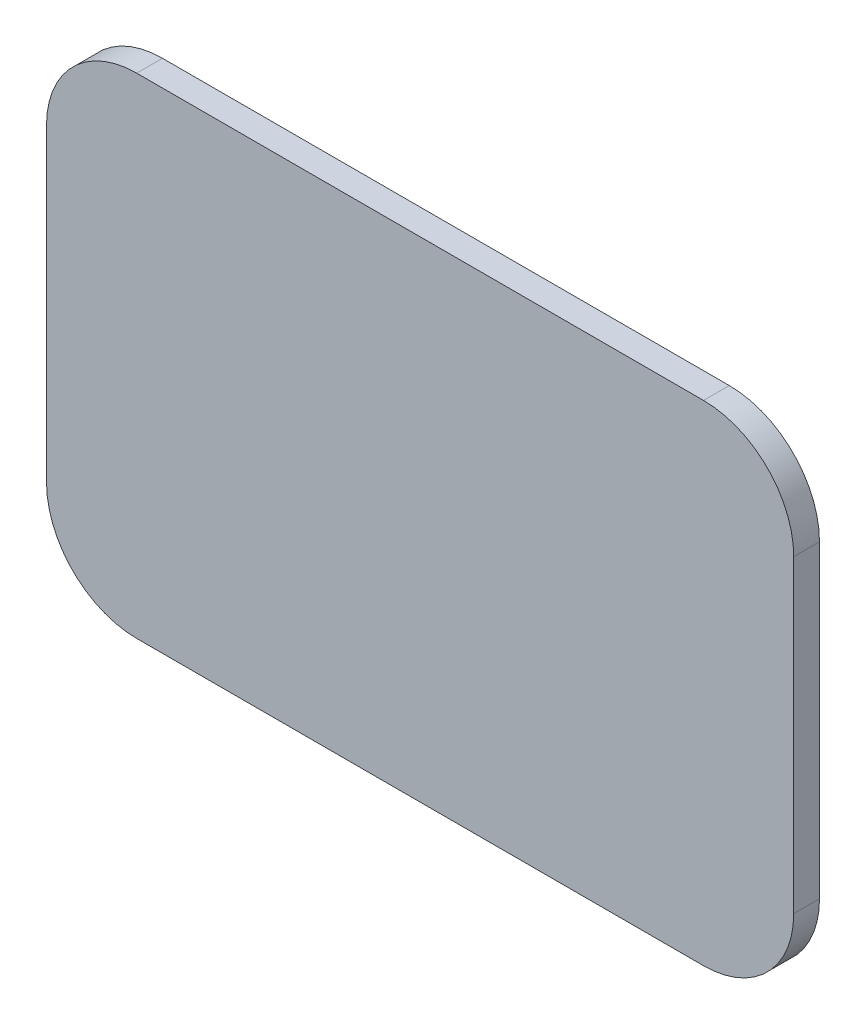
ISO-10303-21;
HEADER;
FILE_DESCRIPTION(('STEP AP214'),'2;1');
FILE_NAME('part.step','',(''),(''),'','','');
FILE_SCHEMA(('AUTOMOTIVE_DESIGN { 1 0 10303 214 1 1 1 1 }'));
ENDSEC;
DATA;
#1=APPLICATION_CONTEXT('core data for automotive mechanical design processes');
#2=APPLICATION_PROTOCOL_DEFINITION('international standard','automotive_design',2000,#1);
#3=PRODUCT_CONTEXT('',#1,'mechanical');
#4=PRODUCT('Part','Part','',(#3));
#5=PRODUCT_RELATED_PRODUCT_CATEGORY('part','',(#4));
#6=PRODUCT_DEFINITION_FORMATION('','',#4);
#7=PRODUCT_DEFINITION_CONTEXT('part definition',#1,'design');
#8=PRODUCT_DEFINITION('design','',#6,#7);
#9=PRODUCT_DEFINITION_SHAPE('','',#8);
#10=(LENGTH_UNIT() NAMED_UNIT(*) SI_UNIT(.MILLI.,.METRE.));
#11=(NAMED_UNIT(*) PLANE_ANGLE_UNIT() SI_UNIT($,.RADIAN.));
#12=(NAMED_UNIT(*) SI_UNIT($,.STERADIAN.) SOLID_ANGLE_UNIT());
#13=UNCERTAINTY_MEASURE_WITH_UNIT(LENGTH_MEASURE(1.E-05),#10,'distance_accuracy_value','');
#14=(GEOMETRIC_REPRESENTATION_CONTEXT(3) GLOBAL_UNCERTAINTY_ASSIGNED_CONTEXT((#13)) GLOBAL_UNIT_ASSIGNED_CONTEXT((#10,
#11,#12)) REPRESENTATION_CONTEXT('',''));
#15=CARTESIAN_POINT('',(0.,0.,0.));
#16=DIRECTION('',(0.,0.,1.));
#17=DIRECTION('',(1.,0.,0.));
#18=AXIS2_PLACEMENT_3D('',#15,#16,#17);
#19=CARTESIAN_POINT('',(-14.5,0.,1.));
#20=DIRECTION('',(-1.,0.,0.));
#21=DIRECTION('',(0.,0.,1.));
#22=AXIS2_PLACEMENT_3D('',#19,#20,#21);
#23=PLANE('',#22);
#24=DIRECTION('',(0.,1.00000000000001,0.));
#25=VECTOR('',#24,1.);
#26=CARTESIAN_POINT('',(-14.5,0.,0.));
#27=LINE('',#26,#25);
#28=CARTESIAN_POINT('',(-14.5,-6.00000000000032,0.));
#29=VERTEX_POINT('',#28);
#30=CARTESIAN_POINT('',(-14.5,5.99999999999998,0.));
#31=VERTEX_POINT('',#30);
#32=EDGE_CURVE('E127',#29,#31,#27,.T.);
#33=ORIENTED_EDGE('',*,*,#32,.F.);
#34=DIRECTION('',(0.,0.,-1.));
#35=VECTOR('',#34,1.);
#36=CARTESIAN_POINT('',(-14.5,-6.00000000000032,1.00000000000005));
#37=LINE('',#36,#35);
#38=CARTESIAN_POINT('',(-14.5,-6.00000000000032,1.00000000000005));
#39=VERTEX_POINT('',#38);
#40=EDGE_CURVE('E11',#39,#29,#37,.T.);
#41=ORIENTED_EDGE('',*,*,#40,.F.);
#42=DIRECTION('',(0.,1.00000000000001,0.));
#43=VECTOR('',#42,1.);
#44=CARTESIAN_POINT('',(-14.5,0.,1.));
#45=LINE('',#44,#43);
#46=CARTESIAN_POINT('',(-14.5,5.99999999999998,1.));
#47=VERTEX_POINT('',#46);
#48=EDGE_CURVE('E143',#39,#47,#45,.T.);
#49=ORIENTED_EDGE('',*,*,#48,.T.);
#50=DIRECTION('',(0.,0.,-1.));
#51=VECTOR('',#50,1.);
#52=CARTESIAN_POINT('',(-14.5,5.99999999999998,1.));
#53=LINE('',#52,#51);
#54=EDGE_CURVE('E83',#47,#31,#53,.T.);
#55=ORIENTED_EDGE('',*,*,#54,.T.);
#56=EDGE_LOOP('',(#33,#41,#49,#55));
#57=FACE_BOUND('',#56,.T.);
#58=ADVANCED_FACE('F33',(#57),#23,.T.);
#59=CARTESIAN_POINT('',(-11.,-6.00000000000035,1.00000000000005));
#60=DIRECTION('',(0.,0.,-1.));
#61=DIRECTION('',(-1.,0.,0.));
#62=AXIS2_PLACEMENT_3D('',#59,#60,#61);
#63=CYLINDRICAL_SURFACE('',#62,3.5);
#64=CARTESIAN_POINT('',(-11.,-6.00000000000035,0.));
#65=DIRECTION('',(0.,0.,1.00000000000001));
#66=DIRECTION('',(1.,0.,0.));
#67=AXIS2_PLACEMENT_3D('',#64,#65,#66);
#68=CIRCLE('',#67,3.5);
#69=CARTESIAN_POINT('',(-11.,-9.50000000000001,0.));
#70=VERTEX_POINT('',#69);
#71=EDGE_CURVE('E130',#29,#70,#68,.T.);
#72=ORIENTED_EDGE('',*,*,#71,.T.);
#73=DIRECTION('',(0.,0.,-1.));
#74=VECTOR('',#73,1.);
#75=CARTESIAN_POINT('',(-11.,-9.50000000000001,1.00000000000005));
#76=LINE('',#75,#74);
#77=CARTESIAN_POINT('',(-11.,-9.50000000000001,1.00000000000005));
#78=VERTEX_POINT('',#77);
#79=EDGE_CURVE('E41',#78,#70,#76,.T.);
#80=ORIENTED_EDGE('',*,*,#79,.F.);
#81=CARTESIAN_POINT('',(-11.,-6.00000000000035,1.00000000000005));
#82=DIRECTION('',(0.,0.,1.00000000000001));
#83=DIRECTION('',(1.,0.,0.));
#84=AXIS2_PLACEMENT_3D('',#81,#82,#83);
#85=CIRCLE('',#84,3.5);
#86=EDGE_CURVE('E176',#39,#78,#85,.T.);
#87=ORIENTED_EDGE('',*,*,#86,.F.);
#88=ORIENTED_EDGE('',*,*,#40,.T.);
#89=EDGE_LOOP('',(#72,#80,#87,#88));
#90=FACE_BOUND('',#89,.T.);
#91=ADVANCED_FACE('F178',(#90),#63,.T.);
#92=CARTESIAN_POINT('',(0.,-9.50000000000001,1.00000000000005));
#93=DIRECTION('',(0.,1.,0.));
#94=DIRECTION('',(0.,0.,1.));
#95=AXIS2_PLACEMENT_3D('',#92,#93,#94);
#96=PLANE('',#95);
#97=DIRECTION('',(1.,0.,0.));
#98=VECTOR('',#97,1.);
#99=CARTESIAN_POINT('',(0.,-9.50000000000001,0.));
#100=LINE('',#99,#98);
#101=CARTESIAN_POINT('',(11.,-9.50000000000001,0.));
#102=VERTEX_POINT('',#101);
#103=EDGE_CURVE('E132',#70,#102,#100,.T.);
#104=ORIENTED_EDGE('',*,*,#103,.T.);
#105=DIRECTION('',(0.,0.,-1.));
#106=VECTOR('',#105,1.);
#107=CARTESIAN_POINT('',(11.,-9.50000000000001,1.00000000000005));
#108=LINE('',#107,#106);
#109=CARTESIAN_POINT('',(11.,-9.50000000000001,1.00000000000005));
#110=VERTEX_POINT('',#109);
#111=EDGE_CURVE('E150',#110,#102,#108,.T.);
#112=ORIENTED_EDGE('',*,*,#111,.F.);
#113=DIRECTION('',(1.,0.,0.));
#114=VECTOR('',#113,1.);
#115=CARTESIAN_POINT('',(0.,-9.50000000000001,1.00000000000005));
#116=LINE('',#115,#114);
#117=EDGE_CURVE('E159',#78,#110,#116,.T.);
#118=ORIENTED_EDGE('',*,*,#117,.F.);
#119=ORIENTED_EDGE('',*,*,#79,.T.);
#120=EDGE_LOOP('',(#104,#112,#118,#119));
#121=FACE_BOUND('',#120,.T.);
#122=ADVANCED_FACE('F157',(#121),#96,.F.);
#123=CARTESIAN_POINT('',(11.,-6.00000000000035,1.00000000000005));
#124=DIRECTION('',(0.,0.,-1.));
#125=DIRECTION('',(-1.,0.,0.));
#126=AXIS2_PLACEMENT_3D('',#123,#124,#125);
#127=CYLINDRICAL_SURFACE('',#126,3.5);
#128=CARTESIAN_POINT('',(11.,-6.00000000000035,0.));
#129=DIRECTION('',(0.,0.,1.00000000000001));
#130=DIRECTION('',(1.,0.,0.));
#131=AXIS2_PLACEMENT_3D('',#128,#129,#130);
#132=CIRCLE('',#131,3.5);
#133=CARTESIAN_POINT('',(14.5,-6.00000000000034,0.));
#134=VERTEX_POINT('',#133);
#135=EDGE_CURVE('E134',#102,#134,#132,.T.);
#136=ORIENTED_EDGE('',*,*,#135,.T.);
#137=DIRECTION('',(0.,0.,-1.));
#138=VECTOR('',#137,1.);
#139=CARTESIAN_POINT('',(14.5,-6.00000000000034,1.00000000000005));
#140=LINE('',#139,#138);
#141=CARTESIAN_POINT('',(14.5,-6.00000000000034,1.00000000000005));
#142=VERTEX_POINT('',#141);
#143=EDGE_CURVE('E147',#142,#134,#140,.T.);
#144=ORIENTED_EDGE('',*,*,#143,.F.);
#145=CARTESIAN_POINT('',(11.,-6.00000000000035,1.00000000000005));
#146=DIRECTION('',(0.,0.,1.00000000000001));
#147=DIRECTION('',(1.,0.,0.));
#148=AXIS2_PLACEMENT_3D('',#145,#146,#147);
#149=CIRCLE('',#148,3.5);
#150=EDGE_CURVE('E172',#110,#142,#149,.T.);
#151=ORIENTED_EDGE('',*,*,#150,.F.);
#152=ORIENTED_EDGE('',*,*,#111,.T.);
#153=EDGE_LOOP('',(#136,#144,#151,#152));
#154=FACE_BOUND('',#153,.T.);
#155=ADVANCED_FACE('F168',(#154),#127,.T.);
#156=CARTESIAN_POINT('',(14.5,0.,1.));
#157=DIRECTION('',(-1.,0.,0.));
#158=DIRECTION('',(0.,0.,1.));
#159=AXIS2_PLACEMENT_3D('',#156,#157,#158);
#160=PLANE('',#159);
#161=DIRECTION('',(0.,1.00000000000001,0.));
#162=VECTOR('',#161,1.);
#163=CARTESIAN_POINT('',(14.5,0.,0.));
#164=LINE('',#163,#162);
#165=CARTESIAN_POINT('',(14.5,5.99999999999996,0.));
#166=VERTEX_POINT('',#165);
#167=EDGE_CURVE('E136',#134,#166,#164,.T.);
#168=ORIENTED_EDGE('',*,*,#167,.T.);
#169=DIRECTION('',(0.,0.,-1.));
#170=VECTOR('',#169,1.);
#171=CARTESIAN_POINT('',(14.5,5.99999999999996,1.));
#172=LINE('',#171,#170);
#173=CARTESIAN_POINT('',(14.5,5.99999999999996,1.));
#174=VERTEX_POINT('',#173);
#175=EDGE_CURVE('E120',#174,#166,#172,.T.);
#176=ORIENTED_EDGE('',*,*,#175,.F.);
#177=DIRECTION('',(0.,1.00000000000001,0.));
#178=VECTOR('',#177,1.);
#179=CARTESIAN_POINT('',(14.5,0.,1.));
#180=LINE('',#179,#178);
#181=EDGE_CURVE('E107',#142,#174,#180,.T.);
#182=ORIENTED_EDGE('',*,*,#181,.F.);
#183=ORIENTED_EDGE('',*,*,#143,.T.);
#184=EDGE_LOOP('',(#168,#176,#182,#183));
#185=FACE_BOUND('',#184,.T.);
#186=ADVANCED_FACE('F171',(#185),#160,.F.);
#187=CARTESIAN_POINT('',(11.,5.99999999999999,1.));
#188=DIRECTION('',(0.,0.,-1.));
#189=DIRECTION('',(-1.,0.,0.));
#190=AXIS2_PLACEMENT_3D('',#187,#188,#189);
#191=CYLINDRICAL_SURFACE('',#190,3.5);
#192=CARTESIAN_POINT('',(11.,5.99999999999999,0.));
#193=DIRECTION('',(0.,0.,1.00000000000001));
#194=DIRECTION('',(1.,0.,0.));
#195=AXIS2_PLACEMENT_3D('',#192,#193,#194);
#196=CIRCLE('',#195,3.5);
#197=CARTESIAN_POINT('',(11.,9.50000000000001,0.));
#198=VERTEX_POINT('',#197);
#199=EDGE_CURVE('E116',#166,#198,#196,.T.);
#200=ORIENTED_EDGE('',*,*,#199,.T.);
#201=DIRECTION('',(0.,0.,-1.));
#202=VECTOR('',#201,1.);
#203=CARTESIAN_POINT('',(11.,9.50000000000001,1.));
#204=LINE('',#203,#202);
#205=CARTESIAN_POINT('',(11.,9.50000000000001,1.));
#206=VERTEX_POINT('',#205);
#207=EDGE_CURVE('E113',#206,#198,#204,.T.);
#208=ORIENTED_EDGE('',*,*,#207,.F.);
#209=CARTESIAN_POINT('',(11.,5.99999999999999,1.));
#210=DIRECTION('',(0.,0.,1.00000000000001));
#211=DIRECTION('',(1.,0.,0.));
#212=AXIS2_PLACEMENT_3D('',#209,#210,#211);
#213=CIRCLE('',#212,3.5);
#214=EDGE_CURVE('E101',#174,#206,#213,.T.);
#215=ORIENTED_EDGE('',*,*,#214,.F.);
#216=ORIENTED_EDGE('',*,*,#175,.T.);
#217=EDGE_LOOP('',(#200,#208,#215,#216));
#218=FACE_BOUND('',#217,.T.);
#219=ADVANCED_FACE('F114',(#218),#191,.T.);
#220=CARTESIAN_POINT('',(0.,9.50000000000001,1.));
#221=DIRECTION('',(0.,1.,0.));
#222=DIRECTION('',(-1.,0.,0.));
#223=AXIS2_PLACEMENT_3D('',#220,#221,#222);
#224=PLANE('',#223);
#225=DIRECTION('',(1.,0.,0.));
#226=VECTOR('',#225,1.);
#227=CARTESIAN_POINT('',(0.,9.50000000000001,0.));
#228=LINE('',#227,#226);
#229=CARTESIAN_POINT('',(-11.,9.50000000000001,0.));
#230=VERTEX_POINT('',#229);
#231=EDGE_CURVE('E139',#230,#198,#228,.T.);
#232=ORIENTED_EDGE('',*,*,#231,.F.);
#233=DIRECTION('',(0.,0.,-1.));
#234=VECTOR('',#233,1.);
#235=CARTESIAN_POINT('',(-11.,9.50000000000001,1.));
#236=LINE('',#235,#234);
#237=CARTESIAN_POINT('',(-11.,9.50000000000001,1.));
#238=VERTEX_POINT('',#237);
#239=EDGE_CURVE('E76',#238,#230,#236,.T.);
#240=ORIENTED_EDGE('',*,*,#239,.F.);
#241=DIRECTION('',(1.,0.,0.));
#242=VECTOR('',#241,1.);
#243=CARTESIAN_POINT('',(0.,9.50000000000001,1.));
#244=LINE('',#243,#242);
#245=EDGE_CURVE('E105',#238,#206,#244,.T.);
#246=ORIENTED_EDGE('',*,*,#245,.T.);
#247=ORIENTED_EDGE('',*,*,#207,.T.);
#248=EDGE_LOOP('',(#232,#240,#246,#247));
#249=FACE_BOUND('',#248,.T.);
#250=ADVANCED_FACE('F122',(#249),#224,.T.);
#251=CARTESIAN_POINT('',(-11.,5.99999999999999,1.));
#252=DIRECTION('',(0.,0.,-1.));
#253=DIRECTION('',(-1.,0.,0.));
#254=AXIS2_PLACEMENT_3D('',#251,#252,#253);
#255=CYLINDRICAL_SURFACE('',#254,3.5);
#256=CARTESIAN_POINT('',(-11.,5.99999999999999,0.));
#257=DIRECTION('',(0.,0.,1.00000000000001));
#258=DIRECTION('',(1.,0.,0.));
#259=AXIS2_PLACEMENT_3D('',#256,#257,#258);
#260=CIRCLE('',#259,3.5);
#261=EDGE_CURVE('E141',#230,#31,#260,.T.);
#262=ORIENTED_EDGE('',*,*,#261,.T.);
#263=ORIENTED_EDGE('',*,*,#54,.F.);
#264=CARTESIAN_POINT('',(-11.,5.99999999999999,1.));
#265=DIRECTION('',(0.,0.,1.00000000000001));
#266=DIRECTION('',(1.,0.,0.));
#267=AXIS2_PLACEMENT_3D('',#264,#265,#266);
#268=CIRCLE('',#267,3.5);
#269=EDGE_CURVE('E49',#238,#47,#268,.T.);
#270=ORIENTED_EDGE('',*,*,#269,.F.);
#271=ORIENTED_EDGE('',*,*,#239,.T.);
#272=EDGE_LOOP('',(#262,#263,#270,#271));
#273=FACE_BOUND('',#272,.T.);
#274=ADVANCED_FACE('F194',(#273),#255,.T.);
#275=CARTESIAN_POINT('',(0.,0.,1.));
#276=DIRECTION('',(0.,0.,1.00000000000001));
#277=DIRECTION('',(1.,0.,0.));
#278=AXIS2_PLACEMENT_3D('',#275,#276,#277);
#279=PLANE('',#278);
#280=ORIENTED_EDGE('',*,*,#48,.F.);
#281=ORIENTED_EDGE('',*,*,#86,.T.);
#282=ORIENTED_EDGE('',*,*,#117,.T.);
#283=ORIENTED_EDGE('',*,*,#150,.T.);
#284=ORIENTED_EDGE('',*,*,#181,.T.);
#285=ORIENTED_EDGE('',*,*,#214,.T.);
#286=ORIENTED_EDGE('',*,*,#245,.F.);
#287=ORIENTED_EDGE('',*,*,#269,.T.);
#288=EDGE_LOOP('',(#280,#281,#282,#283,#284,#285,#286,#287));
#289=FACE_BOUND('',#288,.T.);
#290=ADVANCED_FACE('F103',(#289),#279,.T.);
#291=CARTESIAN_POINT('',(0.,0.,0.));
#292=DIRECTION('',(0.,0.,1.00000000000001));
#293=DIRECTION('',(1.,0.,0.));
#294=AXIS2_PLACEMENT_3D('',#291,#292,#293);
#295=PLANE('',#294);
#296=ORIENTED_EDGE('',*,*,#32,.T.);
#297=ORIENTED_EDGE('',*,*,#261,.F.);
#298=ORIENTED_EDGE('',*,*,#231,.T.);
#299=ORIENTED_EDGE('',*,*,#199,.F.);
#300=ORIENTED_EDGE('',*,*,#167,.F.);
#301=ORIENTED_EDGE('',*,*,#135,.F.);
#302=ORIENTED_EDGE('',*,*,#103,.F.);
#303=ORIENTED_EDGE('',*,*,#71,.F.);
#304=EDGE_LOOP('',(#296,#297,#298,#299,#300,#301,#302,#303));
#305=FACE_BOUND('',#304,.T.);
#306=ADVANCED_FACE('F164',(#305),#295,.F.);
#307=CLOSED_SHELL('',(#58,#91,#122,#155,#186,#219,#250,#274,#290,#306));
#308=MANIFOLD_SOLID_BREP('B2',#307);
#309=ADVANCED_BREP_SHAPE_REPRESENTATION('',(#18,#308),#14);
#310=SHAPE_DEFINITION_REPRESENTATION(#9,#309);
ENDSEC;
END-ISO-10303-21;
